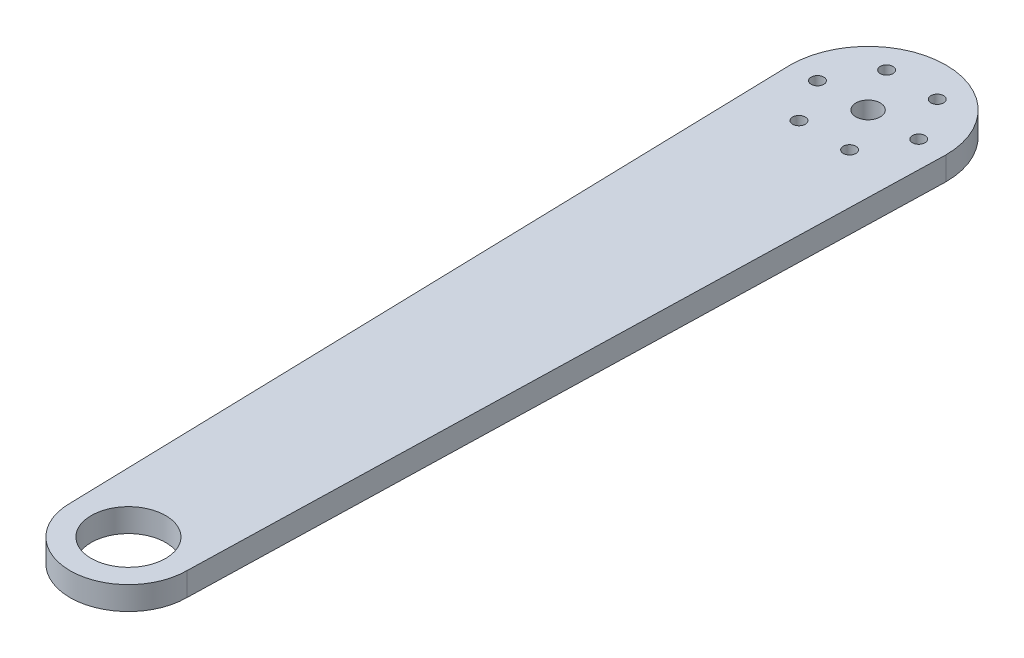
ISO-10303-21;
HEADER;
FILE_DESCRIPTION(('STEP AP214'),'2;1');
FILE_NAME('part.step','',(''),(''),'','','');
FILE_SCHEMA(('AUTOMOTIVE_DESIGN { 1 0 10303 214 1 1 1 1 }'));
ENDSEC;
DATA;
#1=APPLICATION_CONTEXT('core data for automotive mechanical design processes');
#2=APPLICATION_PROTOCOL_DEFINITION('international standard','automotive_design',2000,#1);
#3=PRODUCT_CONTEXT('',#1,'mechanical');
#4=PRODUCT('Part','Part','',(#3));
#5=PRODUCT_RELATED_PRODUCT_CATEGORY('part','',(#4));
#6=PRODUCT_DEFINITION_FORMATION('','',#4);
#7=PRODUCT_DEFINITION_CONTEXT('part definition',#1,'design');
#8=PRODUCT_DEFINITION('design','',#6,#7);
#9=PRODUCT_DEFINITION_SHAPE('','',#8);
#10=(LENGTH_UNIT() NAMED_UNIT(*) SI_UNIT(.MILLI.,.METRE.));
#11=(NAMED_UNIT(*) PLANE_ANGLE_UNIT() SI_UNIT($,.RADIAN.));
#12=(NAMED_UNIT(*) SI_UNIT($,.STERADIAN.) SOLID_ANGLE_UNIT());
#13=UNCERTAINTY_MEASURE_WITH_UNIT(LENGTH_MEASURE(1.E-05),#10,'distance_accuracy_value','');
#14=(GEOMETRIC_REPRESENTATION_CONTEXT(3) GLOBAL_UNCERTAINTY_ASSIGNED_CONTEXT((#13)) GLOBAL_UNIT_ASSIGNED_CONTEXT((#10,
#11,#12)) REPRESENTATION_CONTEXT('',''));
#15=CARTESIAN_POINT('',(0.,0.,0.));
#16=DIRECTION('',(0.,0.,1.));
#17=DIRECTION('',(1.,0.,0.));
#18=AXIS2_PLACEMENT_3D('',#15,#16,#17);
#19=CARTESIAN_POINT('',(0.,6.,190.));
#20=DIRECTION('',(0.,1.,0.));
#21=DIRECTION('',(0.,0.,1.));
#22=AXIS2_PLACEMENT_3D('',#19,#20,#21);
#23=PLANE('',#22);
#24=CARTESIAN_POINT('',(-6.50000000000013,6.,11.2583302491976));
#25=DIRECTION('',(0.,1.,0.));
#26=DIRECTION('',(0.,0.,1.));
#27=AXIS2_PLACEMENT_3D('',#24,#25,#26);
#28=CIRCLE('',#27,1.625);
#29=CARTESIAN_POINT('',(-6.50000000000013,6.,12.8833302491976));
#30=VERTEX_POINT('',#29);
#31=EDGE_CURVE('E151',#30,#30,#28,.T.);
#32=ORIENTED_EDGE('',*,*,#31,.F.);
#33=EDGE_LOOP('',(#32));
#34=FACE_BOUND('',#33,.T.);
#35=CARTESIAN_POINT('',(13.,6.,0.));
#36=DIRECTION('',(0.,1.,0.));
#37=DIRECTION('',(0.,0.,1.));
#38=AXIS2_PLACEMENT_3D('',#35,#36,#37);
#39=CIRCLE('',#38,1.625);
#40=CARTESIAN_POINT('',(13.,6.,1.62500000000009));
#41=VERTEX_POINT('',#40);
#42=EDGE_CURVE('E139',#41,#41,#39,.T.);
#43=ORIENTED_EDGE('',*,*,#42,.F.);
#44=EDGE_LOOP('',(#43));
#45=FACE_BOUND('',#44,.T.);
#46=CARTESIAN_POINT('',(-6.49999999999997,6.,-11.2583302491977));
#47=DIRECTION('',(0.,1.,0.));
#48=DIRECTION('',(0.,0.,1.));
#49=AXIS2_PLACEMENT_3D('',#46,#47,#48);
#50=CIRCLE('',#49,1.625);
#51=CARTESIAN_POINT('',(-6.49999999999997,6.,-9.63333024919772));
#52=VERTEX_POINT('',#51);
#53=EDGE_CURVE('E127',#52,#52,#50,.T.);
#54=ORIENTED_EDGE('',*,*,#53,.F.);
#55=EDGE_LOOP('',(#54));
#56=FACE_BOUND('',#55,.T.);
#57=CARTESIAN_POINT('',(0.,6.,0.));
#58=DIRECTION('',(0.,1.,0.));
#59=DIRECTION('',(0.,0.,1.));
#60=AXIS2_PLACEMENT_3D('',#57,#58,#59);
#61=CIRCLE('',#60,3.125);
#62=CARTESIAN_POINT('',(0.,6.,3.125));
#63=VERTEX_POINT('',#62);
#64=EDGE_CURVE('E106',#63,#63,#61,.T.);
#65=ORIENTED_EDGE('',*,*,#64,.F.);
#66=EDGE_LOOP('',(#65));
#67=FACE_BOUND('',#66,.T.);
#68=CARTESIAN_POINT('',(0.,6.,190.));
#69=DIRECTION('',(0.,1.,0.));
#70=DIRECTION('',(0.,0.,1.));
#71=AXIS2_PLACEMENT_3D('',#68,#69,#70);
#72=CIRCLE('',#71,15.);
#73=CARTESIAN_POINT('',(-15.,6.,190.));
#74=VERTEX_POINT('',#73);
#75=CARTESIAN_POINT('',(15.,6.,190.));
#76=VERTEX_POINT('',#75);
#77=EDGE_CURVE('E91',#74,#76,#72,.T.);
#78=ORIENTED_EDGE('',*,*,#77,.T.);
#79=DIRECTION('',(0.0263066820882328,0.,-0.999653919352847));
#80=VECTOR('',#79,1.);
#81=CARTESIAN_POINT('',(20.,6.,0.));
#82=LINE('',#81,#80);
#83=CARTESIAN_POINT('',(20.,6.,0.));
#84=VERTEX_POINT('',#83);
#85=EDGE_CURVE('E86',#76,#84,#82,.T.);
#86=ORIENTED_EDGE('',*,*,#85,.T.);
#87=CARTESIAN_POINT('',(0.,6.,0.));
#88=DIRECTION('',(0.,1.,0.));
#89=DIRECTION('',(0.,0.,1.));
#90=AXIS2_PLACEMENT_3D('',#87,#88,#89);
#91=CIRCLE('',#90,20.);
#92=CARTESIAN_POINT('',(-20.,6.,0.));
#93=VERTEX_POINT('',#92);
#94=EDGE_CURVE('E89',#84,#93,#91,.T.);
#95=ORIENTED_EDGE('',*,*,#94,.T.);
#96=DIRECTION('',(0.0263066820882328,0.,0.999653919352847));
#97=VECTOR('',#96,1.);
#98=CARTESIAN_POINT('',(-15.,6.,190.));
#99=LINE('',#98,#97);
#100=EDGE_CURVE('E56',#93,#74,#99,.T.);
#101=ORIENTED_EDGE('',*,*,#100,.T.);
#102=EDGE_LOOP('',(#78,#86,#95,#101));
#103=FACE_BOUND('',#102,.T.);
#104=CARTESIAN_POINT('',(-13.,6.,0.));
#105=DIRECTION('',(0.,1.,0.));
#106=DIRECTION('',(0.,0.,1.));
#107=AXIS2_PLACEMENT_3D('',#104,#105,#106);
#108=CIRCLE('',#107,1.625);
#109=CARTESIAN_POINT('',(-13.,6.,1.625));
#110=VERTEX_POINT('',#109);
#111=EDGE_CURVE('E121',#110,#110,#108,.T.);
#112=ORIENTED_EDGE('',*,*,#111,.F.);
#113=EDGE_LOOP('',(#112));
#114=FACE_BOUND('',#113,.T.);
#115=CARTESIAN_POINT('',(6.50000000000005,6.,-11.2583302491977));
#116=DIRECTION('',(0.,1.,0.));
#117=DIRECTION('',(0.,0.,1.));
#118=AXIS2_PLACEMENT_3D('',#115,#116,#117);
#119=CIRCLE('',#118,1.625);
#120=CARTESIAN_POINT('',(6.50000000000005,6.,-9.63333024919767));
#121=VERTEX_POINT('',#120);
#122=EDGE_CURVE('E133',#121,#121,#119,.T.);
#123=ORIENTED_EDGE('',*,*,#122,.F.);
#124=EDGE_LOOP('',(#123));
#125=FACE_BOUND('',#124,.T.);
#126=CARTESIAN_POINT('',(6.49999999999989,6.,11.2583302491978));
#127=DIRECTION('',(0.,1.,0.));
#128=DIRECTION('',(0.,0.,1.));
#129=AXIS2_PLACEMENT_3D('',#126,#127,#128);
#130=CIRCLE('',#129,1.625);
#131=CARTESIAN_POINT('',(6.49999999999989,6.,12.8833302491978));
#132=VERTEX_POINT('',#131);
#133=EDGE_CURVE('E145',#132,#132,#130,.T.);
#134=ORIENTED_EDGE('',*,*,#133,.F.);
#135=EDGE_LOOP('',(#134));
#136=FACE_BOUND('',#135,.T.);
#137=CARTESIAN_POINT('',(0.,6.,190.));
#138=DIRECTION('',(0.,1.,0.));
#139=DIRECTION('',(0.,0.,1.));
#140=AXIS2_PLACEMENT_3D('',#137,#138,#139);
#141=CIRCLE('',#140,9.55);
#142=CARTESIAN_POINT('',(0.,6.,199.55));
#143=VERTEX_POINT('',#142);
#144=EDGE_CURVE('E157',#143,#143,#141,.T.);
#145=ORIENTED_EDGE('',*,*,#144,.F.);
#146=EDGE_LOOP('',(#145));
#147=FACE_BOUND('',#146,.T.);
#148=ADVANCED_FACE('F39',(#34,#45,#56,#67,#103,#114,#125,#136,#147),#23,.T.);
#149=CARTESIAN_POINT('',(0.,0.,190.));
#150=DIRECTION('',(0.,1.,0.));
#151=DIRECTION('',(0.,0.,1.));
#152=AXIS2_PLACEMENT_3D('',#149,#150,#151);
#153=PLANE('',#152);
#154=CARTESIAN_POINT('',(0.,0.,190.));
#155=DIRECTION('',(0.,1.,0.));
#156=DIRECTION('',(0.,0.,1.));
#157=AXIS2_PLACEMENT_3D('',#154,#155,#156);
#158=CIRCLE('',#157,15.);
#159=CARTESIAN_POINT('',(-15.,0.,190.));
#160=VERTEX_POINT('',#159);
#161=CARTESIAN_POINT('',(15.,0.,190.));
#162=VERTEX_POINT('',#161);
#163=EDGE_CURVE('E103',#160,#162,#158,.T.);
#164=ORIENTED_EDGE('',*,*,#163,.F.);
#165=DIRECTION('',(0.0263066820882328,0.,0.999653919352847));
#166=VECTOR('',#165,1.);
#167=CARTESIAN_POINT('',(-15.,0.,190.));
#168=LINE('',#167,#166);
#169=CARTESIAN_POINT('',(-20.,0.,0.));
#170=VERTEX_POINT('',#169);
#171=EDGE_CURVE('E79',#170,#160,#168,.T.);
#172=ORIENTED_EDGE('',*,*,#171,.F.);
#173=CARTESIAN_POINT('',(0.,0.,0.));
#174=DIRECTION('',(0.,1.,0.));
#175=DIRECTION('',(0.,0.,1.));
#176=AXIS2_PLACEMENT_3D('',#173,#174,#175);
#177=CIRCLE('',#176,20.);
#178=CARTESIAN_POINT('',(20.,0.,0.));
#179=VERTEX_POINT('',#178);
#180=EDGE_CURVE('E73',#179,#170,#177,.T.);
#181=ORIENTED_EDGE('',*,*,#180,.F.);
#182=DIRECTION('',(0.0263066820882328,0.,-0.999653919352847));
#183=VECTOR('',#182,1.);
#184=CARTESIAN_POINT('',(20.,0.,0.));
#185=LINE('',#184,#183);
#186=EDGE_CURVE('E95',#162,#179,#185,.T.);
#187=ORIENTED_EDGE('',*,*,#186,.F.);
#188=EDGE_LOOP('',(#164,#172,#181,#187));
#189=FACE_BOUND('',#188,.T.);
#190=CARTESIAN_POINT('',(0.,0.,0.));
#191=DIRECTION('',(0.,1.,0.));
#192=DIRECTION('',(0.,0.,1.));
#193=AXIS2_PLACEMENT_3D('',#190,#191,#192);
#194=CIRCLE('',#193,3.125);
#195=CARTESIAN_POINT('',(0.,0.,3.125));
#196=VERTEX_POINT('',#195);
#197=EDGE_CURVE('E118',#196,#196,#194,.T.);
#198=ORIENTED_EDGE('',*,*,#197,.T.);
#199=EDGE_LOOP('',(#198));
#200=FACE_BOUND('',#199,.T.);
#201=CARTESIAN_POINT('',(-13.,0.,0.));
#202=DIRECTION('',(0.,1.,0.));
#203=DIRECTION('',(0.,0.,1.));
#204=AXIS2_PLACEMENT_3D('',#201,#202,#203);
#205=CIRCLE('',#204,1.625);
#206=CARTESIAN_POINT('',(-13.,0.,1.625));
#207=VERTEX_POINT('',#206);
#208=EDGE_CURVE('E124',#207,#207,#205,.T.);
#209=ORIENTED_EDGE('',*,*,#208,.T.);
#210=EDGE_LOOP('',(#209));
#211=FACE_BOUND('',#210,.T.);
#212=CARTESIAN_POINT('',(-6.49999999999997,0.,-11.2583302491977));
#213=DIRECTION('',(0.,1.,0.));
#214=DIRECTION('',(0.,0.,1.));
#215=AXIS2_PLACEMENT_3D('',#212,#213,#214);
#216=CIRCLE('',#215,1.625);
#217=CARTESIAN_POINT('',(-6.49999999999997,0.,-9.63333024919772));
#218=VERTEX_POINT('',#217);
#219=EDGE_CURVE('E130',#218,#218,#216,.T.);
#220=ORIENTED_EDGE('',*,*,#219,.T.);
#221=EDGE_LOOP('',(#220));
#222=FACE_BOUND('',#221,.T.);
#223=CARTESIAN_POINT('',(6.50000000000005,0.,-11.2583302491977));
#224=DIRECTION('',(0.,1.,0.));
#225=DIRECTION('',(0.,0.,1.));
#226=AXIS2_PLACEMENT_3D('',#223,#224,#225);
#227=CIRCLE('',#226,1.625);
#228=CARTESIAN_POINT('',(6.50000000000005,0.,-9.63333024919767));
#229=VERTEX_POINT('',#228);
#230=EDGE_CURVE('E136',#229,#229,#227,.T.);
#231=ORIENTED_EDGE('',*,*,#230,.T.);
#232=EDGE_LOOP('',(#231));
#233=FACE_BOUND('',#232,.T.);
#234=CARTESIAN_POINT('',(13.,0.,0.));
#235=DIRECTION('',(0.,1.,0.));
#236=DIRECTION('',(0.,0.,1.));
#237=AXIS2_PLACEMENT_3D('',#234,#235,#236);
#238=CIRCLE('',#237,1.625);
#239=CARTESIAN_POINT('',(13.,0.,1.62500000000009));
#240=VERTEX_POINT('',#239);
#241=EDGE_CURVE('E142',#240,#240,#238,.T.);
#242=ORIENTED_EDGE('',*,*,#241,.T.);
#243=EDGE_LOOP('',(#242));
#244=FACE_BOUND('',#243,.T.);
#245=CARTESIAN_POINT('',(6.49999999999989,0.,11.2583302491978));
#246=DIRECTION('',(0.,1.,0.));
#247=DIRECTION('',(0.,0.,1.));
#248=AXIS2_PLACEMENT_3D('',#245,#246,#247);
#249=CIRCLE('',#248,1.625);
#250=CARTESIAN_POINT('',(6.49999999999989,0.,12.8833302491978));
#251=VERTEX_POINT('',#250);
#252=EDGE_CURVE('E148',#251,#251,#249,.T.);
#253=ORIENTED_EDGE('',*,*,#252,.T.);
#254=EDGE_LOOP('',(#253));
#255=FACE_BOUND('',#254,.T.);
#256=CARTESIAN_POINT('',(-6.50000000000013,0.,11.2583302491976));
#257=DIRECTION('',(0.,1.,0.));
#258=DIRECTION('',(0.,0.,1.));
#259=AXIS2_PLACEMENT_3D('',#256,#257,#258);
#260=CIRCLE('',#259,1.625);
#261=CARTESIAN_POINT('',(-6.50000000000013,0.,12.8833302491976));
#262=VERTEX_POINT('',#261);
#263=EDGE_CURVE('E154',#262,#262,#260,.T.);
#264=ORIENTED_EDGE('',*,*,#263,.T.);
#265=EDGE_LOOP('',(#264));
#266=FACE_BOUND('',#265,.T.);
#267=CARTESIAN_POINT('',(0.,0.,190.));
#268=DIRECTION('',(0.,1.,0.));
#269=DIRECTION('',(0.,0.,1.));
#270=AXIS2_PLACEMENT_3D('',#267,#268,#269);
#271=CIRCLE('',#270,9.55);
#272=CARTESIAN_POINT('',(0.,0.,199.55));
#273=VERTEX_POINT('',#272);
#274=EDGE_CURVE('E160',#273,#273,#271,.T.);
#275=ORIENTED_EDGE('',*,*,#274,.T.);
#276=EDGE_LOOP('',(#275));
#277=FACE_BOUND('',#276,.T.);
#278=ADVANCED_FACE('F114',(#189,#200,#211,#222,#233,#244,#255,#266,#277),#153,.F.);
#279=CARTESIAN_POINT('',(0.,6.,190.));
#280=DIRECTION('',(0.,-1.,0.));
#281=DIRECTION('',(0.,0.,-1.));
#282=AXIS2_PLACEMENT_3D('',#279,#280,#281);
#283=CYLINDRICAL_SURFACE('',#282,15.);
#284=ORIENTED_EDGE('',*,*,#163,.T.);
#285=DIRECTION('',(0.,-1.,0.));
#286=VECTOR('',#285,1.);
#287=CARTESIAN_POINT('',(15.,6.,190.));
#288=LINE('',#287,#286);
#289=EDGE_CURVE('E11',#76,#162,#288,.T.);
#290=ORIENTED_EDGE('',*,*,#289,.F.);
#291=ORIENTED_EDGE('',*,*,#77,.F.);
#292=DIRECTION('',(0.,-1.,0.));
#293=VECTOR('',#292,1.);
#294=CARTESIAN_POINT('',(-15.,6.,190.));
#295=LINE('',#294,#293);
#296=EDGE_CURVE('E99',#74,#160,#295,.T.);
#297=ORIENTED_EDGE('',*,*,#296,.T.);
#298=EDGE_LOOP('',(#284,#290,#291,#297));
#299=FACE_BOUND('',#298,.T.);
#300=ADVANCED_FACE('F41',(#299),#283,.T.);
#301=CARTESIAN_POINT('',(20.,6.,0.));
#302=DIRECTION('',(-0.999653919352847,0.,-0.0263066820882328));
#303=DIRECTION('',(-0.0263066820882328,0.,0.999653919352847));
#304=AXIS2_PLACEMENT_3D('',#301,#302,#303);
#305=PLANE('',#304);
#306=ORIENTED_EDGE('',*,*,#186,.T.);
#307=DIRECTION('',(0.,-1.,0.));
#308=VECTOR('',#307,1.);
#309=CARTESIAN_POINT('',(20.,6.,0.));
#310=LINE('',#309,#308);
#311=EDGE_CURVE('E48',#84,#179,#310,.T.);
#312=ORIENTED_EDGE('',*,*,#311,.F.);
#313=ORIENTED_EDGE('',*,*,#85,.F.);
#314=ORIENTED_EDGE('',*,*,#289,.T.);
#315=EDGE_LOOP('',(#306,#312,#313,#314));
#316=FACE_BOUND('',#315,.T.);
#317=ADVANCED_FACE('F94',(#316),#305,.F.);
#318=CARTESIAN_POINT('',(0.,6.,0.));
#319=DIRECTION('',(0.,-1.,0.));
#320=DIRECTION('',(0.,0.,-1.));
#321=AXIS2_PLACEMENT_3D('',#318,#319,#320);
#322=CYLINDRICAL_SURFACE('',#321,20.);
#323=ORIENTED_EDGE('',*,*,#180,.T.);
#324=DIRECTION('',(0.,-1.,0.));
#325=VECTOR('',#324,1.);
#326=CARTESIAN_POINT('',(-20.,6.,0.));
#327=LINE('',#326,#325);
#328=EDGE_CURVE('E96',#93,#170,#327,.T.);
#329=ORIENTED_EDGE('',*,*,#328,.F.);
#330=ORIENTED_EDGE('',*,*,#94,.F.);
#331=ORIENTED_EDGE('',*,*,#311,.T.);
#332=EDGE_LOOP('',(#323,#329,#330,#331));
#333=FACE_BOUND('',#332,.T.);
#334=ADVANCED_FACE('F97',(#333),#322,.T.);
#335=CARTESIAN_POINT('',(-15.,6.,190.));
#336=DIRECTION('',(0.999653919352847,0.,-0.0263066820882328));
#337=DIRECTION('',(-0.0263066820882328,0.,-0.999653919352847));
#338=AXIS2_PLACEMENT_3D('',#335,#336,#337);
#339=PLANE('',#338);
#340=ORIENTED_EDGE('',*,*,#171,.T.);
#341=ORIENTED_EDGE('',*,*,#296,.F.);
#342=ORIENTED_EDGE('',*,*,#100,.F.);
#343=ORIENTED_EDGE('',*,*,#328,.T.);
#344=EDGE_LOOP('',(#340,#341,#342,#343));
#345=FACE_BOUND('',#344,.T.);
#346=ADVANCED_FACE('F111',(#345),#339,.F.);
#347=CARTESIAN_POINT('',(0.,6.,0.));
#348=DIRECTION('',(0.,-1.,0.));
#349=DIRECTION('',(0.,0.,-1.));
#350=AXIS2_PLACEMENT_3D('',#347,#348,#349);
#351=CYLINDRICAL_SURFACE('',#350,3.125);
#352=ORIENTED_EDGE('',*,*,#64,.T.);
#353=EDGE_LOOP('',(#352));
#354=FACE_BOUND('',#353,.T.);
#355=ORIENTED_EDGE('',*,*,#197,.F.);
#356=EDGE_LOOP('',(#355));
#357=FACE_BOUND('',#356,.T.);
#358=ADVANCED_FACE('F179',(#354,#357),#351,.F.);
#359=CARTESIAN_POINT('',(-13.,6.,0.));
#360=DIRECTION('',(0.,-1.,0.));
#361=DIRECTION('',(0.,0.,-1.));
#362=AXIS2_PLACEMENT_3D('',#359,#360,#361);
#363=CYLINDRICAL_SURFACE('',#362,1.625);
#364=ORIENTED_EDGE('',*,*,#111,.T.);
#365=EDGE_LOOP('',(#364));
#366=FACE_BOUND('',#365,.T.);
#367=ORIENTED_EDGE('',*,*,#208,.F.);
#368=EDGE_LOOP('',(#367));
#369=FACE_BOUND('',#368,.T.);
#370=ADVANCED_FACE('F233',(#366,#369),#363,.F.);
#371=CARTESIAN_POINT('',(-6.49999999999997,6.,-11.2583302491977));
#372=DIRECTION('',(0.,-1.,0.));
#373=DIRECTION('',(0.,0.,-1.));
#374=AXIS2_PLACEMENT_3D('',#371,#372,#373);
#375=CYLINDRICAL_SURFACE('',#374,1.625);
#376=ORIENTED_EDGE('',*,*,#53,.T.);
#377=EDGE_LOOP('',(#376));
#378=FACE_BOUND('',#377,.T.);
#379=ORIENTED_EDGE('',*,*,#219,.F.);
#380=EDGE_LOOP('',(#379));
#381=FACE_BOUND('',#380,.T.);
#382=ADVANCED_FACE('F242',(#378,#381),#375,.F.);
#383=CARTESIAN_POINT('',(6.50000000000005,6.,-11.2583302491977));
#384=DIRECTION('',(0.,-1.,0.));
#385=DIRECTION('',(0.,0.,-1.));
#386=AXIS2_PLACEMENT_3D('',#383,#384,#385);
#387=CYLINDRICAL_SURFACE('',#386,1.625);
#388=ORIENTED_EDGE('',*,*,#122,.T.);
#389=EDGE_LOOP('',(#388));
#390=FACE_BOUND('',#389,.T.);
#391=ORIENTED_EDGE('',*,*,#230,.F.);
#392=EDGE_LOOP('',(#391));
#393=FACE_BOUND('',#392,.T.);
#394=ADVANCED_FACE('F251',(#390,#393),#387,.F.);
#395=CARTESIAN_POINT('',(13.,6.,0.));
#396=DIRECTION('',(0.,-1.,0.));
#397=DIRECTION('',(0.,0.,-1.));
#398=AXIS2_PLACEMENT_3D('',#395,#396,#397);
#399=CYLINDRICAL_SURFACE('',#398,1.625);
#400=ORIENTED_EDGE('',*,*,#42,.T.);
#401=EDGE_LOOP('',(#400));
#402=FACE_BOUND('',#401,.T.);
#403=ORIENTED_EDGE('',*,*,#241,.F.);
#404=EDGE_LOOP('',(#403));
#405=FACE_BOUND('',#404,.T.);
#406=ADVANCED_FACE('F261',(#402,#405),#399,.F.);
#407=CARTESIAN_POINT('',(6.49999999999989,6.,11.2583302491978));
#408=DIRECTION('',(0.,-1.,0.));
#409=DIRECTION('',(0.,0.,-1.));
#410=AXIS2_PLACEMENT_3D('',#407,#408,#409);
#411=CYLINDRICAL_SURFACE('',#410,1.625);
#412=ORIENTED_EDGE('',*,*,#133,.T.);
#413=EDGE_LOOP('',(#412));
#414=FACE_BOUND('',#413,.T.);
#415=ORIENTED_EDGE('',*,*,#252,.F.);
#416=EDGE_LOOP('',(#415));
#417=FACE_BOUND('',#416,.T.);
#418=ADVANCED_FACE('F271',(#414,#417),#411,.F.);
#419=CARTESIAN_POINT('',(-6.50000000000013,6.,11.2583302491976));
#420=DIRECTION('',(0.,-1.,0.));
#421=DIRECTION('',(0.,0.,-1.));
#422=AXIS2_PLACEMENT_3D('',#419,#420,#421);
#423=CYLINDRICAL_SURFACE('',#422,1.625);
#424=ORIENTED_EDGE('',*,*,#31,.T.);
#425=EDGE_LOOP('',(#424));
#426=FACE_BOUND('',#425,.T.);
#427=ORIENTED_EDGE('',*,*,#263,.F.);
#428=EDGE_LOOP('',(#427));
#429=FACE_BOUND('',#428,.T.);
#430=ADVANCED_FACE('F281',(#426,#429),#423,.F.);
#431=CARTESIAN_POINT('',(0.,6.,190.));
#432=DIRECTION('',(0.,-1.,0.));
#433=DIRECTION('',(0.,0.,-1.));
#434=AXIS2_PLACEMENT_3D('',#431,#432,#433);
#435=CYLINDRICAL_SURFACE('',#434,9.55);
#436=ORIENTED_EDGE('',*,*,#144,.T.);
#437=EDGE_LOOP('',(#436));
#438=FACE_BOUND('',#437,.T.);
#439=ORIENTED_EDGE('',*,*,#274,.F.);
#440=EDGE_LOOP('',(#439));
#441=FACE_BOUND('',#440,.T.);
#442=ADVANCED_FACE('F166',(#438,#441),#435,.F.);
#443=CLOSED_SHELL('',(#148,#278,#300,#317,#334,#346,#358,#370,#382,#394,#406,#418,#430,#442));
#444=MANIFOLD_SOLID_BREP('B2',#443);
#445=ADVANCED_BREP_SHAPE_REPRESENTATION('',(#18,#444),#14);
#446=SHAPE_DEFINITION_REPRESENTATION(#9,#445);
ENDSEC;
END-ISO-10303-21;
